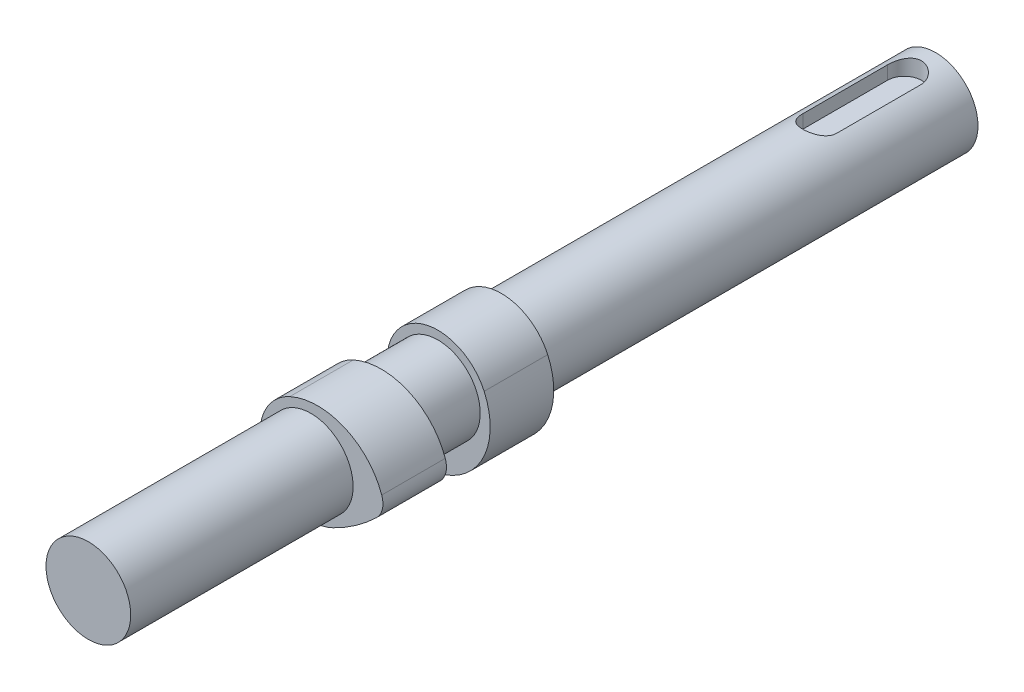
ISO-10303-21;
HEADER;
FILE_DESCRIPTION(('STEP AP214'),'2;1');
FILE_NAME('part.step','',(''),(''),'','','');
FILE_SCHEMA(('AUTOMOTIVE_DESIGN { 1 0 10303 214 1 1 1 1 }'));
ENDSEC;
DATA;
#1=APPLICATION_CONTEXT('core data for automotive mechanical design processes');
#2=APPLICATION_PROTOCOL_DEFINITION('international standard','automotive_design',2000,#1);
#3=PRODUCT_CONTEXT('',#1,'mechanical');
#4=PRODUCT('Part','Part','',(#3));
#5=PRODUCT_RELATED_PRODUCT_CATEGORY('part','',(#4));
#6=PRODUCT_DEFINITION_FORMATION('','',#4);
#7=PRODUCT_DEFINITION_CONTEXT('part definition',#1,'design');
#8=PRODUCT_DEFINITION('design','',#6,#7);
#9=PRODUCT_DEFINITION_SHAPE('','',#8);
#10=(LENGTH_UNIT() NAMED_UNIT(*) SI_UNIT(.MILLI.,.METRE.));
#11=(NAMED_UNIT(*) PLANE_ANGLE_UNIT() SI_UNIT($,.RADIAN.));
#12=(NAMED_UNIT(*) SI_UNIT($,.STERADIAN.) SOLID_ANGLE_UNIT());
#13=UNCERTAINTY_MEASURE_WITH_UNIT(LENGTH_MEASURE(1.E-05),#10,'distance_accuracy_value','');
#14=(GEOMETRIC_REPRESENTATION_CONTEXT(3) GLOBAL_UNCERTAINTY_ASSIGNED_CONTEXT((#13)) GLOBAL_UNIT_ASSIGNED_CONTEXT((#10,
#11,#12)) REPRESENTATION_CONTEXT('',''));
#15=CARTESIAN_POINT('',(0.,0.,0.));
#16=DIRECTION('',(0.,0.,1.));
#17=DIRECTION('',(1.,0.,0.));
#18=AXIS2_PLACEMENT_3D('',#15,#16,#17);
#19=CARTESIAN_POINT('',(0.,0.,200.));
#20=DIRECTION('',(0.,0.,-1.));
#21=DIRECTION('',(-1.,0.,0.));
#22=AXIS2_PLACEMENT_3D('',#19,#20,#21);
#23=CYLINDRICAL_SURFACE('',#22,10.);
#24=CARTESIAN_POINT('',(0.,0.,132.5));
#25=DIRECTION('',(0.,0.,-1.));
#26=DIRECTION('',(-1.,0.,0.));
#27=AXIS2_PLACEMENT_3D('',#24,#25,#26);
#28=CIRCLE('',#27,10.);
#29=CARTESIAN_POINT('',(-10.,0.,132.5));
#30=VERTEX_POINT('',#29);
#31=EDGE_CURVE('E210',#30,#30,#28,.T.);
#32=ORIENTED_EDGE('',*,*,#31,.T.);
#33=EDGE_LOOP('',(#32));
#34=FACE_BOUND('',#33,.T.);
#35=CARTESIAN_POINT('',(0.,0.,117.5));
#36=DIRECTION('',(0.,0.,-1.));
#37=DIRECTION('',(-1.,0.,0.));
#38=AXIS2_PLACEMENT_3D('',#35,#36,#37);
#39=CIRCLE('',#38,10.);
#40=CARTESIAN_POINT('',(-10.,0.,117.5));
#41=VERTEX_POINT('',#40);
#42=EDGE_CURVE('E11',#41,#41,#39,.T.);
#43=ORIENTED_EDGE('',*,*,#42,.F.);
#44=EDGE_LOOP('',(#43));
#45=FACE_BOUND('',#44,.T.);
#46=ADVANCED_FACE('F39',(#34,#45),#23,.T.);
#47=CARTESIAN_POINT('',(1.6509102244389,-3.64341809717785,147.5));
#48=DIRECTION('',(0.,0.,-1.));
#49=DIRECTION('',(-1.,0.,0.));
#50=AXIS2_PLACEMENT_3D('',#47,#48,#49);
#51=CYLINDRICAL_SURFACE('',#50,16.);
#52=CARTESIAN_POINT('',(1.6509102244389,-3.64341809717785,132.5));
#53=DIRECTION('',(0.,0.,1.));
#54=DIRECTION('',(-1.,0.,0.));
#55=AXIS2_PLACEMENT_3D('',#52,#53,#54);
#56=CIRCLE('',#55,16.);
#57=CARTESIAN_POINT('',(16.7477680798005,1.65609913508084,132.5));
#58=VERTEX_POINT('',#57);
#59=CARTESIAN_POINT('',(-4.9527306733167,10.9302542915336,132.5));
#60=VERTEX_POINT('',#59);
#61=EDGE_CURVE('E164',#58,#60,#56,.T.);
#62=ORIENTED_EDGE('',*,*,#61,.T.);
#63=DIRECTION('',(0.,0.,-1.));
#64=VECTOR('',#63,1.);
#65=CARTESIAN_POINT('',(-4.9527306733167,10.9302542915336,147.5));
#66=LINE('',#65,#64);
#67=CARTESIAN_POINT('',(-4.9527306733167,10.9302542915336,147.5));
#68=VERTEX_POINT('',#67);
#69=EDGE_CURVE('E206',#68,#60,#66,.T.);
#70=ORIENTED_EDGE('',*,*,#69,.F.);
#71=CARTESIAN_POINT('',(1.6509102244389,-3.64341809717785,147.5));
#72=DIRECTION('',(0.,0.,1.));
#73=DIRECTION('',(-1.,0.,0.));
#74=AXIS2_PLACEMENT_3D('',#71,#72,#73);
#75=CIRCLE('',#74,16.);
#76=CARTESIAN_POINT('',(16.7477680798005,1.65609913508084,147.5));
#77=VERTEX_POINT('',#76);
#78=EDGE_CURVE('E169',#77,#68,#75,.T.);
#79=ORIENTED_EDGE('',*,*,#78,.F.);
#80=DIRECTION('',(0.,0.,-1.));
#81=VECTOR('',#80,1.);
#82=CARTESIAN_POINT('',(16.7477680798005,1.65609913508084,147.5));
#83=LINE('',#82,#81);
#84=EDGE_CURVE('E183',#77,#58,#83,.T.);
#85=ORIENTED_EDGE('',*,*,#84,.T.);
#86=EDGE_LOOP('',(#62,#70,#79,#85));
#87=FACE_BOUND('',#86,.T.);
#88=ADVANCED_FACE('F289',(#87),#51,.T.);
#89=CARTESIAN_POINT('',(0.,0.,147.5));
#90=DIRECTION('',(0.,0.,-1.));
#91=DIRECTION('',(-1.,0.,0.));
#92=AXIS2_PLACEMENT_3D('',#89,#90,#91);
#93=CYLINDRICAL_SURFACE('',#92,12.);
#94=CARTESIAN_POINT('',(0.,0.,132.5));
#95=DIRECTION('',(0.,0.,1.));
#96=DIRECTION('',(1.,0.,0.));
#97=AXIS2_PLACEMENT_3D('',#94,#95,#96);
#98=CIRCLE('',#97,12.);
#99=CARTESIAN_POINT('',(5.27750445315283,-10.777195681018,132.5));
#100=VERTEX_POINT('',#99);
#101=EDGE_CURVE('E187',#60,#100,#98,.T.);
#102=ORIENTED_EDGE('',*,*,#101,.T.);
#103=DIRECTION('',(0.,0.,-1.));
#104=VECTOR('',#103,1.);
#105=CARTESIAN_POINT('',(5.27750445315283,-10.777195681018,147.5));
#106=LINE('',#105,#104);
#107=CARTESIAN_POINT('',(5.27750445315283,-10.777195681018,147.5));
#108=VERTEX_POINT('',#107);
#109=EDGE_CURVE('E202',#108,#100,#106,.T.);
#110=ORIENTED_EDGE('',*,*,#109,.F.);
#111=CARTESIAN_POINT('',(0.,0.,147.5));
#112=DIRECTION('',(0.,0.,1.));
#113=DIRECTION('',(1.,0.,0.));
#114=AXIS2_PLACEMENT_3D('',#111,#112,#113);
#115=CIRCLE('',#114,12.);
#116=EDGE_CURVE('E173',#68,#108,#115,.T.);
#117=ORIENTED_EDGE('',*,*,#116,.F.);
#118=ORIENTED_EDGE('',*,*,#69,.T.);
#119=EDGE_LOOP('',(#102,#110,#117,#118));
#120=FACE_BOUND('',#119,.T.);
#121=ADVANCED_FACE('F294',(#120),#93,.T.);
#122=CARTESIAN_POINT('',(-12.3141770573566,25.1467899223752,147.5));
#123=DIRECTION('',(0.,0.,-1.));
#124=DIRECTION('',(-1.,0.,0.));
#125=AXIS2_PLACEMENT_3D('',#122,#123,#124);
#126=CYLINDRICAL_SURFACE('',#125,40.);
#127=CARTESIAN_POINT('',(-12.3141770573566,25.1467899223752,132.5));
#128=DIRECTION('',(0.,0.,1.));
#129=DIRECTION('',(-1.,0.,0.));
#130=AXIS2_PLACEMENT_3D('',#127,#128,#129);
#131=CIRCLE('',#130,40.);
#132=CARTESIAN_POINT('',(15.5077395796224,-3.5923985603393,132.5));
#133=VERTEX_POINT('',#132);
#134=EDGE_CURVE('E190',#100,#133,#131,.T.);
#135=ORIENTED_EDGE('',*,*,#134,.T.);
#136=DIRECTION('',(0.,0.,-1.));
#137=VECTOR('',#136,1.);
#138=CARTESIAN_POINT('',(15.5077395796224,-3.5923985603393,147.5));
#139=LINE('',#138,#137);
#140=CARTESIAN_POINT('',(15.5077395796224,-3.5923985603393,147.5));
#141=VERTEX_POINT('',#140);
#142=EDGE_CURVE('E198',#141,#133,#139,.T.);
#143=ORIENTED_EDGE('',*,*,#142,.F.);
#144=CARTESIAN_POINT('',(-12.3141770573566,25.1467899223752,147.5));
#145=DIRECTION('',(0.,0.,1.));
#146=DIRECTION('',(-1.,0.,0.));
#147=AXIS2_PLACEMENT_3D('',#144,#145,#146);
#148=CIRCLE('',#147,40.);
#149=EDGE_CURVE('E177',#108,#141,#148,.T.);
#150=ORIENTED_EDGE('',*,*,#149,.F.);
#151=ORIENTED_EDGE('',*,*,#109,.T.);
#152=EDGE_LOOP('',(#135,#143,#150,#151));
#153=FACE_BOUND('',#152,.T.);
#154=ADVANCED_FACE('F341',(#153),#126,.T.);
#155=CARTESIAN_POINT('',(12.03,0.,147.5));
#156=DIRECTION('',(0.,0.,-1.));
#157=DIRECTION('',(-1.,0.,0.));
#158=AXIS2_PLACEMENT_3D('',#155,#156,#157);
#159=CYLINDRICAL_SURFACE('',#158,5.);
#160=CARTESIAN_POINT('',(12.03,0.,132.5));
#161=DIRECTION('',(0.,0.,1.));
#162=DIRECTION('',(-1.,0.,0.));
#163=AXIS2_PLACEMENT_3D('',#160,#161,#162);
#164=CIRCLE('',#163,5.);
#165=EDGE_CURVE('E174',#133,#58,#164,.T.);
#166=ORIENTED_EDGE('',*,*,#165,.T.);
#167=ORIENTED_EDGE('',*,*,#84,.F.);
#168=CARTESIAN_POINT('',(12.03,0.,147.5));
#169=DIRECTION('',(0.,0.,1.));
#170=DIRECTION('',(-1.,0.,0.));
#171=AXIS2_PLACEMENT_3D('',#168,#169,#170);
#172=CIRCLE('',#171,5.);
#173=EDGE_CURVE('E180',#141,#77,#172,.T.);
#174=ORIENTED_EDGE('',*,*,#173,.F.);
#175=ORIENTED_EDGE('',*,*,#142,.T.);
#176=EDGE_LOOP('',(#166,#167,#174,#175));
#177=FACE_BOUND('',#176,.T.);
#178=ADVANCED_FACE('F345',(#177),#159,.T.);
#179=CARTESIAN_POINT('',(6.84045511221945,-1.82170904858893,147.5));
#180=DIRECTION('',(0.,0.,-1.));
#181=DIRECTION('',(-1.,0.,0.));
#182=AXIS2_PLACEMENT_3D('',#179,#180,#181);
#183=PLANE('',#182);
#184=CARTESIAN_POINT('',(0.,0.,147.5));
#185=DIRECTION('',(0.,0.,-1.));
#186=DIRECTION('',(-1.,0.,0.));
#187=AXIS2_PLACEMENT_3D('',#184,#185,#186);
#188=CIRCLE('',#187,10.);
#189=CARTESIAN_POINT('',(-10.,0.,147.5));
#190=VERTEX_POINT('',#189);
#191=EDGE_CURVE('E49',#190,#190,#188,.T.);
#192=ORIENTED_EDGE('',*,*,#191,.T.);
#193=EDGE_LOOP('',(#192));
#194=FACE_BOUND('',#193,.T.);
#195=ORIENTED_EDGE('',*,*,#78,.T.);
#196=ORIENTED_EDGE('',*,*,#116,.T.);
#197=ORIENTED_EDGE('',*,*,#149,.T.);
#198=ORIENTED_EDGE('',*,*,#173,.T.);
#199=EDGE_LOOP('',(#195,#196,#197,#198));
#200=FACE_BOUND('',#199,.T.);
#201=ADVANCED_FACE('F349',(#194,#200),#183,.F.);
#202=CARTESIAN_POINT('',(6.84045511221945,-1.82170904858893,132.5));
#203=DIRECTION('',(0.,0.,-1.));
#204=DIRECTION('',(-1.,0.,0.));
#205=AXIS2_PLACEMENT_3D('',#202,#203,#204);
#206=PLANE('',#205);
#207=ORIENTED_EDGE('',*,*,#31,.F.);
#208=EDGE_LOOP('',(#207));
#209=FACE_BOUND('',#208,.T.);
#210=ORIENTED_EDGE('',*,*,#61,.F.);
#211=ORIENTED_EDGE('',*,*,#165,.F.);
#212=ORIENTED_EDGE('',*,*,#134,.F.);
#213=ORIENTED_EDGE('',*,*,#101,.F.);
#214=EDGE_LOOP('',(#210,#211,#212,#213));
#215=FACE_BOUND('',#214,.T.);
#216=ADVANCED_FACE('F279',(#209,#215),#206,.T.);
#217=CARTESIAN_POINT('',(0.,0.,200.));
#218=DIRECTION('',(0.,0.,1.));
#219=DIRECTION('',(1.,0.,0.));
#220=AXIS2_PLACEMENT_3D('',#217,#218,#219);
#221=PLANE('',#220);
#222=CARTESIAN_POINT('',(0.,0.,200.));
#223=DIRECTION('',(0.,0.,1.));
#224=DIRECTION('',(1.,0.,0.));
#225=AXIS2_PLACEMENT_3D('',#222,#223,#224);
#226=CIRCLE('',#225,10.);
#227=CARTESIAN_POINT('',(10.,0.,200.));
#228=VERTEX_POINT('',#227);
#229=EDGE_CURVE('E239',#228,#228,#226,.T.);
#230=ORIENTED_EDGE('',*,*,#229,.T.);
#231=EDGE_LOOP('',(#230));
#232=FACE_BOUND('',#231,.T.);
#233=ADVANCED_FACE('F276',(#232),#221,.T.);
#234=ORIENTED_EDGE('',*,*,#229,.F.);
#235=EDGE_LOOP('',(#234));
#236=FACE_BOUND('',#235,.T.);
#237=ORIENTED_EDGE('',*,*,#191,.F.);
#238=EDGE_LOOP('',(#237));
#239=FACE_BOUND('',#238,.T.);
#240=ADVANCED_FACE('F278',(#236,#239),#23,.T.);
#241=CARTESIAN_POINT('',(-3.64341809717782,-1.65091022443892,117.5));
#242=DIRECTION('',(0.,0.,-1.));
#243=DIRECTION('',(-1.,0.,0.));
#244=AXIS2_PLACEMENT_3D('',#241,#242,#243);
#245=CYLINDRICAL_SURFACE('',#244,16.);
#246=CARTESIAN_POINT('',(-3.64341809717782,-1.65091022443892,102.5));
#247=DIRECTION('',(0.,0.,1.));
#248=DIRECTION('',(-1.,0.,0.));
#249=AXIS2_PLACEMENT_3D('',#246,#247,#248);
#250=CIRCLE('',#249,16.);
#251=CARTESIAN_POINT('',(1.65609913508084,-16.7477680798005,102.5));
#252=VERTEX_POINT('',#251);
#253=CARTESIAN_POINT('',(10.9302542915335,4.9527306733168,102.5));
#254=VERTEX_POINT('',#253);
#255=EDGE_CURVE('E157',#252,#254,#250,.T.);
#256=ORIENTED_EDGE('',*,*,#255,.T.);
#257=DIRECTION('',(0.,0.,-1.));
#258=VECTOR('',#257,1.);
#259=CARTESIAN_POINT('',(10.9302542915335,4.9527306733168,117.5));
#260=LINE('',#259,#258);
#261=CARTESIAN_POINT('',(10.9302542915335,4.9527306733168,117.5));
#262=VERTEX_POINT('',#261);
#263=EDGE_CURVE('E135',#262,#254,#260,.T.);
#264=ORIENTED_EDGE('',*,*,#263,.F.);
#265=CARTESIAN_POINT('',(-3.64341809717782,-1.65091022443892,117.5));
#266=DIRECTION('',(0.,0.,1.));
#267=DIRECTION('',(-1.,0.,0.));
#268=AXIS2_PLACEMENT_3D('',#265,#266,#267);
#269=CIRCLE('',#268,16.);
#270=CARTESIAN_POINT('',(1.65609913508084,-16.7477680798005,117.5));
#271=VERTEX_POINT('',#270);
#272=EDGE_CURVE('E143',#271,#262,#269,.T.);
#273=ORIENTED_EDGE('',*,*,#272,.F.);
#274=DIRECTION('',(0.,0.,-1.));
#275=VECTOR('',#274,1.);
#276=CARTESIAN_POINT('',(1.65609913508084,-16.7477680798005,117.5));
#277=LINE('',#276,#275);
#278=EDGE_CURVE('E495',#271,#252,#277,.T.);
#279=ORIENTED_EDGE('',*,*,#278,.T.);
#280=EDGE_LOOP('',(#256,#264,#273,#279));
#281=FACE_BOUND('',#280,.T.);
#282=ADVANCED_FACE('F155',(#281),#245,.T.);
#283=CARTESIAN_POINT('',(0.,0.,117.5));
#284=DIRECTION('',(0.,0.,-1.));
#285=DIRECTION('',(-1.,0.,0.));
#286=AXIS2_PLACEMENT_3D('',#283,#284,#285);
#287=CYLINDRICAL_SURFACE('',#286,12.);
#288=CARTESIAN_POINT('',(0.,0.,102.5));
#289=DIRECTION('',(0.,0.,1.));
#290=DIRECTION('',(1.,0.,0.));
#291=AXIS2_PLACEMENT_3D('',#288,#289,#290);
#292=CIRCLE('',#291,12.);
#293=CARTESIAN_POINT('',(-10.777195681018,-5.27750445315283,102.5));
#294=VERTEX_POINT('',#293);
#295=EDGE_CURVE('E504',#254,#294,#292,.T.);
#296=ORIENTED_EDGE('',*,*,#295,.T.);
#297=DIRECTION('',(0.,0.,-1.));
#298=VECTOR('',#297,1.);
#299=CARTESIAN_POINT('',(-10.777195681018,-5.27750445315283,117.5));
#300=LINE('',#299,#298);
#301=CARTESIAN_POINT('',(-10.777195681018,-5.27750445315283,117.5));
#302=VERTEX_POINT('',#301);
#303=EDGE_CURVE('E138',#302,#294,#300,.T.);
#304=ORIENTED_EDGE('',*,*,#303,.F.);
#305=CARTESIAN_POINT('',(0.,0.,117.5));
#306=DIRECTION('',(0.,0.,1.));
#307=DIRECTION('',(1.,0.,0.));
#308=AXIS2_PLACEMENT_3D('',#305,#306,#307);
#309=CIRCLE('',#308,12.);
#310=EDGE_CURVE('E131',#262,#302,#309,.T.);
#311=ORIENTED_EDGE('',*,*,#310,.F.);
#312=ORIENTED_EDGE('',*,*,#263,.T.);
#313=EDGE_LOOP('',(#296,#304,#311,#312));
#314=FACE_BOUND('',#313,.T.);
#315=ADVANCED_FACE('F133',(#314),#287,.T.);
#316=CARTESIAN_POINT('',(25.1467899223752,12.3141770573566,117.5));
#317=DIRECTION('',(0.,0.,-1.));
#318=DIRECTION('',(-1.,0.,0.));
#319=AXIS2_PLACEMENT_3D('',#316,#317,#318);
#320=CYLINDRICAL_SURFACE('',#319,40.);
#321=CARTESIAN_POINT('',(25.1467899223752,12.3141770573566,102.5));
#322=DIRECTION('',(0.,0.,1.));
#323=DIRECTION('',(-1.,0.,0.));
#324=AXIS2_PLACEMENT_3D('',#321,#322,#323);
#325=CIRCLE('',#324,40.);
#326=CARTESIAN_POINT('',(-3.59239856033932,-15.5077395796224,102.5));
#327=VERTEX_POINT('',#326);
#328=EDGE_CURVE('E500',#294,#327,#325,.T.);
#329=ORIENTED_EDGE('',*,*,#328,.T.);
#330=DIRECTION('',(0.,0.,-1.));
#331=VECTOR('',#330,1.);
#332=CARTESIAN_POINT('',(-3.59239856033932,-15.5077395796224,117.5));
#333=LINE('',#332,#331);
#334=CARTESIAN_POINT('',(-3.59239856033932,-15.5077395796224,117.5));
#335=VERTEX_POINT('',#334);
#336=EDGE_CURVE('E165',#335,#327,#333,.T.);
#337=ORIENTED_EDGE('',*,*,#336,.F.);
#338=CARTESIAN_POINT('',(25.1467899223752,12.3141770573566,117.5));
#339=DIRECTION('',(0.,0.,1.));
#340=DIRECTION('',(-1.,0.,0.));
#341=AXIS2_PLACEMENT_3D('',#338,#339,#340);
#342=CIRCLE('',#341,40.);
#343=EDGE_CURVE('E142',#302,#335,#342,.T.);
#344=ORIENTED_EDGE('',*,*,#343,.F.);
#345=ORIENTED_EDGE('',*,*,#303,.T.);
#346=EDGE_LOOP('',(#329,#337,#344,#345));
#347=FACE_BOUND('',#346,.T.);
#348=ADVANCED_FACE('F358',(#347),#320,.T.);
#349=CARTESIAN_POINT('',(0.,-12.03,117.5));
#350=DIRECTION('',(0.,0.,-1.));
#351=DIRECTION('',(-1.,0.,0.));
#352=AXIS2_PLACEMENT_3D('',#349,#350,#351);
#353=CYLINDRICAL_SURFACE('',#352,5.00000000000001);
#354=CARTESIAN_POINT('',(0.,-12.03,102.5));
#355=DIRECTION('',(0.,0.,1.));
#356=DIRECTION('',(-1.,0.,0.));
#357=AXIS2_PLACEMENT_3D('',#354,#355,#356);
#358=CIRCLE('',#357,5.00000000000001);
#359=EDGE_CURVE('E153',#327,#252,#358,.T.);
#360=ORIENTED_EDGE('',*,*,#359,.T.);
#361=ORIENTED_EDGE('',*,*,#278,.F.);
#362=CARTESIAN_POINT('',(0.,-12.03,117.5));
#363=DIRECTION('',(0.,0.,1.));
#364=DIRECTION('',(-1.,0.,0.));
#365=AXIS2_PLACEMENT_3D('',#362,#363,#364);
#366=CIRCLE('',#365,5.00000000000001);
#367=EDGE_CURVE('E148',#335,#271,#366,.T.);
#368=ORIENTED_EDGE('',*,*,#367,.F.);
#369=ORIENTED_EDGE('',*,*,#336,.T.);
#370=EDGE_LOOP('',(#360,#361,#368,#369));
#371=FACE_BOUND('',#370,.T.);
#372=ADVANCED_FACE('F361',(#371),#353,.T.);
#373=CARTESIAN_POINT('',(-1.82170904858891,-6.84045511221947,117.5));
#374=DIRECTION('',(0.,0.,-1.));
#375=DIRECTION('',(-1.,0.,0.));
#376=AXIS2_PLACEMENT_3D('',#373,#374,#375);
#377=PLANE('',#376);
#378=ORIENTED_EDGE('',*,*,#42,.T.);
#379=EDGE_LOOP('',(#378));
#380=FACE_BOUND('',#379,.T.);
#381=ORIENTED_EDGE('',*,*,#272,.T.);
#382=ORIENTED_EDGE('',*,*,#310,.T.);
#383=ORIENTED_EDGE('',*,*,#343,.T.);
#384=ORIENTED_EDGE('',*,*,#367,.T.);
#385=EDGE_LOOP('',(#381,#382,#383,#384));
#386=FACE_BOUND('',#385,.T.);
#387=ADVANCED_FACE('F146',(#380,#386),#377,.F.);
#388=CARTESIAN_POINT('',(-1.82170904858891,-6.84045511221947,102.5));
#389=DIRECTION('',(0.,0.,-1.));
#390=DIRECTION('',(-1.,0.,0.));
#391=AXIS2_PLACEMENT_3D('',#388,#389,#390);
#392=PLANE('',#391);
#393=CARTESIAN_POINT('',(0.,0.,102.5));
#394=DIRECTION('',(0.,0.,-1.));
#395=DIRECTION('',(-1.,0.,0.));
#396=AXIS2_PLACEMENT_3D('',#393,#394,#395);
#397=CIRCLE('',#396,10.);
#398=CARTESIAN_POINT('',(-10.,0.,102.5));
#399=VERTEX_POINT('',#398);
#400=EDGE_CURVE('E159',#399,#399,#397,.T.);
#401=ORIENTED_EDGE('',*,*,#400,.F.);
#402=EDGE_LOOP('',(#401));
#403=FACE_BOUND('',#402,.T.);
#404=ORIENTED_EDGE('',*,*,#255,.F.);
#405=ORIENTED_EDGE('',*,*,#359,.F.);
#406=ORIENTED_EDGE('',*,*,#328,.F.);
#407=ORIENTED_EDGE('',*,*,#295,.F.);
#408=EDGE_LOOP('',(#404,#405,#406,#407));
#409=FACE_BOUND('',#408,.T.);
#410=ADVANCED_FACE('F331',(#403,#409),#392,.T.);
#411=CARTESIAN_POINT('',(0.,6.,7.3660851374526));
#412=DIRECTION('',(0.,1.,0.));
#413=DIRECTION('',(0.,0.,1.));
#414=AXIS2_PLACEMENT_3D('',#411,#412,#413);
#415=PLANE('',#414);
#416=CARTESIAN_POINT('',(0.,6.,7.3660851374526));
#417=DIRECTION('',(0.,1.,0.));
#418=DIRECTION('',(0.,0.,1.));
#419=AXIS2_PLACEMENT_3D('',#416,#417,#418);
#420=CIRCLE('',#419,4.);
#421=CARTESIAN_POINT('',(4.,6.,7.3660851374526));
#422=VERTEX_POINT('',#421);
#423=CARTESIAN_POINT('',(-4.,6.,7.3660851374526));
#424=VERTEX_POINT('',#423);
#425=EDGE_CURVE('E211',#422,#424,#420,.T.);
#426=ORIENTED_EDGE('',*,*,#425,.T.);
#427=DIRECTION('',(0.,0.,1.));
#428=VECTOR('',#427,1.);
#429=CARTESIAN_POINT('',(-4.,6.,7.3660851374526));
#430=LINE('',#429,#428);
#431=CARTESIAN_POINT('',(-4.,6.,27.3660851374526));
#432=VERTEX_POINT('',#431);
#433=EDGE_CURVE('E215',#424,#432,#430,.T.);
#434=ORIENTED_EDGE('',*,*,#433,.T.);
#435=CARTESIAN_POINT('',(0.,6.,27.3660851374526));
#436=DIRECTION('',(0.,1.,0.));
#437=DIRECTION('',(0.,0.,1.));
#438=AXIS2_PLACEMENT_3D('',#435,#436,#437);
#439=CIRCLE('',#438,4.);
#440=CARTESIAN_POINT('',(4.,6.,27.3660851374526));
#441=VERTEX_POINT('',#440);
#442=EDGE_CURVE('E219',#432,#441,#439,.T.);
#443=ORIENTED_EDGE('',*,*,#442,.T.);
#444=DIRECTION('',(0.,0.,-1.));
#445=VECTOR('',#444,1.);
#446=CARTESIAN_POINT('',(4.,6.,7.3660851374526));
#447=LINE('',#446,#445);
#448=EDGE_CURVE('E223',#441,#422,#447,.T.);
#449=ORIENTED_EDGE('',*,*,#448,.T.);
#450=EDGE_LOOP('',(#426,#434,#443,#449));
#451=FACE_BOUND('',#450,.T.);
#452=ADVANCED_FACE('F326',(#451),#415,.T.);
#453=CARTESIAN_POINT('',(4.,10.,7.3660851374526));
#454=DIRECTION('',(-1.,0.,0.));
#455=DIRECTION('',(0.,0.,1.));
#456=AXIS2_PLACEMENT_3D('',#453,#454,#455);
#457=PLANE('',#456);
#458=DIRECTION('',(0.,0.,-1.));
#459=VECTOR('',#458,1.);
#460=CARTESIAN_POINT('',(4.,9.16515138991168,200.));
#461=LINE('',#460,#459);
#462=CARTESIAN_POINT('',(4.,9.16515138991168,27.3660851374526));
#463=VERTEX_POINT('',#462);
#464=CARTESIAN_POINT('',(4.,9.16515138991168,7.3660851374526));
#465=VERTEX_POINT('',#464);
#466=EDGE_CURVE('E315',#463,#465,#461,.T.);
#467=ORIENTED_EDGE('',*,*,#466,.T.);
#468=DIRECTION('',(0.,-1.,0.));
#469=VECTOR('',#468,1.);
#470=CARTESIAN_POINT('',(4.,10.,7.3660851374526));
#471=LINE('',#470,#469);
#472=EDGE_CURVE('E227',#465,#422,#471,.T.);
#473=ORIENTED_EDGE('',*,*,#472,.T.);
#474=ORIENTED_EDGE('',*,*,#448,.F.);
#475=DIRECTION('',(0.,-1.,0.));
#476=VECTOR('',#475,1.);
#477=CARTESIAN_POINT('',(4.,10.,27.3660851374526));
#478=LINE('',#477,#476);
#479=EDGE_CURVE('E56',#463,#441,#478,.T.);
#480=ORIENTED_EDGE('',*,*,#479,.F.);
#481=EDGE_LOOP('',(#467,#473,#474,#480));
#482=FACE_BOUND('',#481,.T.);
#483=ADVANCED_FACE('F268',(#482),#457,.T.);
#484=CARTESIAN_POINT('',(0.,10.,7.3660851374526));
#485=DIRECTION('',(0.,-1.,0.));
#486=DIRECTION('',(0.,0.,-1.));
#487=AXIS2_PLACEMENT_3D('',#484,#485,#486);
#488=CYLINDRICAL_SURFACE('',#487,4.);
#489=ORIENTED_EDGE('',*,*,#472,.F.);
#490=CARTESIAN_POINT('',(4.,9.16515138991168,7.3660851374526));
#491=CARTESIAN_POINT('',(4.00001596071937,9.16512928809545,7.25847343239845));
#492=CARTESIAN_POINT('',(3.99565782731265,9.16704612011429,7.1508738062859));
#493=CARTESIAN_POINT('',(3.9783181194646,9.17459250745478,6.93654254091386));
#494=CARTESIAN_POINT('',(3.96533982937531,9.18022064873058,6.8298105867357));
#495=CARTESIAN_POINT('',(3.93095207352899,9.19499565865171,6.61839149434633));
#496=CARTESIAN_POINT('',(3.90957593640916,9.20412861441611,6.51369796936755));
#497=CARTESIAN_POINT('',(3.85863260381273,9.22560106586819,6.30668359402068));
#498=CARTESIAN_POINT('',(3.82906490834147,9.23794075728509,6.20436288889754));
#499=CARTESIAN_POINT('',(3.72853943587111,9.2791858250141,5.90221343629012));
#500=CARTESIAN_POINT('',(3.64568978920221,9.3123489831615,5.70677667606978));
#501=CARTESIAN_POINT('',(3.45096383184146,9.3862474152947,5.33249397729066));
#502=CARTESIAN_POINT('',(3.33905992673093,9.42698987727426,5.15366403154403));
#503=CARTESIAN_POINT('',(3.08263671474505,9.51401998804847,4.80756034408865));
#504=CARTESIAN_POINT('',(2.93673827988499,9.56048491272144,4.64135070355221));
#505=CARTESIAN_POINT('',(2.61939292349377,9.652255810962,4.33500459309109));
#506=CARTESIAN_POINT('',(2.44794076987997,9.69756154495612,4.19487347594541));
#507=CARTESIAN_POINT('',(2.07601181629752,9.78406834216145,3.93927234882814));
#508=CARTESIAN_POINT('',(1.87465586655101,9.82503649102096,3.82499551804244));
#509=CARTESIAN_POINT('',(1.45364828604451,9.89607888234979,3.63239699296125));
#510=CARTESIAN_POINT('',(1.2340043363753,9.92615767032247,3.55406029265928));
#511=CARTESIAN_POINT('',(0.793934884187364,9.97076629361036,3.43940273168169));
#512=CARTESIAN_POINT('',(0.574062114869016,9.98597845290694,3.40123122414947));
#513=CARTESIAN_POINT('',(0.130536855092198,10.001606202074,3.36202818904912));
#514=CARTESIAN_POINT('',(-0.0931142682526846,10.0020270338048,3.36098350420085));
#515=CARTESIAN_POINT('',(-0.524466731987237,9.98843920775428,3.39505077538085));
#516=CARTESIAN_POINT('',(-0.732358330632758,9.97523973659777,3.42813508400578));
#517=CARTESIAN_POINT('',(-1.13934964738689,9.93698538393897,3.52607213836282));
#518=CARTESIAN_POINT('',(-1.33844886722559,9.91192983148495,3.59092668202297));
#519=CARTESIAN_POINT('',(-1.72579479688349,9.85193670608706,3.75135717522455));
#520=CARTESIAN_POINT('',(-1.91383264586892,9.81685584875391,3.84738153329166));
#521=CARTESIAN_POINT('',(-2.27161599563071,9.74029168639969,4.0670164011574));
#522=CARTESIAN_POINT('',(-2.4413550479227,9.69880613681324,4.19063658889047));
#523=CARTESIAN_POINT('',(-2.76952257830691,9.61043706268122,4.47136519488905));
#524=CARTESIAN_POINT('',(-2.92647922614483,9.56337795745419,4.63013815456902));
#525=CARTESIAN_POINT('',(-3.2122147086262,9.47123359153046,4.97207727411541));
#526=CARTESIAN_POINT('',(-3.34098070594789,9.42614923753061,5.15525448625222));
#527=CARTESIAN_POINT('',(-3.51186134851389,9.36326134539254,5.44772078307601));
#528=CARTESIAN_POINT('',(-3.56571263251516,9.34283170142194,5.54975697576753));
#529=CARTESIAN_POINT('',(-3.6645476150566,9.30450957703984,5.75847743986183));
#530=CARTESIAN_POINT('',(-3.70953513634086,9.28661600381593,5.86515968317991));
#531=CARTESIAN_POINT('',(-3.79016254319007,9.25400250539921,6.08231406794887));
#532=CARTESIAN_POINT('',(-3.82581403809399,9.2392786427695,6.19278130749397));
#533=CARTESIAN_POINT('',(-3.88744848158464,9.2135146773091,6.41675350560132));
#534=CARTESIAN_POINT('',(-3.91343576505912,9.20247292309662,6.53025707766516));
#535=CARTESIAN_POINT('',(-3.95619393609845,9.18417798205495,6.76353058479012));
#536=CARTESIAN_POINT('',(-3.97260125584169,9.17707470750587,6.88337933201645));
#537=CARTESIAN_POINT('',(-3.99451448409732,9.16754485606458,7.12417606658965));
#538=CARTESIAN_POINT('',(-4.0000271099601,9.16511539745838,7.24512333037531));
#539=CARTESIAN_POINT('',(-4.,9.16515138991168,7.3660851374526));
#540=B_SPLINE_CURVE_WITH_KNOTS('',3,(#490,#491,#492,#493,#494,#495,#496,#497,#498,#499,#500,
#501,#502,#503,#504,#505,#506,#507,#508,#509,#510,#511,#512,#513,#514,#515,#516,#517,#518,#519,
#520,#521,#522,#523,#524,#525,#526,#527,#528,#529,#530,#531,#532,#533,#534,#535,#536,#537,#538,
#539),.UNSPECIFIED.,.F.,.F.,(4,2,2,2,2,2,2,2,2,2,2,2,2,2,2,2,2,2,2,2,2,2,2,2,4),(0.,
0.322709706217836,0.645296527806424,0.96661582254377,1.28795473422462,1.9293660035182,
2.57138869889252,3.24636095994997,3.92147161082383,4.62325717855528,5.32474946398646,
5.9922775301254,6.65956903033311,7.28937830523071,7.91922322615309,8.55856353859093,
9.19812842270038,9.87963749353245,10.5614562641081,10.9125878460839,11.2635676597188,
11.614108935291,11.964492785171,12.3274303244848,12.6901440171997),.UNSPECIFIED.);
#541=CARTESIAN_POINT('',(-4.,9.16515138991168,7.3660851374526));
#542=VERTEX_POINT('',#541);
#543=EDGE_CURVE('E64',#465,#542,#540,.T.);
#544=ORIENTED_EDGE('',*,*,#543,.T.);
#545=DIRECTION('',(0.,-1.,0.));
#546=VECTOR('',#545,1.);
#547=CARTESIAN_POINT('',(-4.,10.,7.3660851374526));
#548=LINE('',#547,#546);
#549=EDGE_CURVE('E235',#542,#424,#548,.T.);
#550=ORIENTED_EDGE('',*,*,#549,.T.);
#551=ORIENTED_EDGE('',*,*,#425,.F.);
#552=EDGE_LOOP('',(#489,#544,#550,#551));
#553=FACE_BOUND('',#552,.T.);
#554=ADVANCED_FACE('F271',(#553),#488,.F.);
#555=CARTESIAN_POINT('',(-4.,10.,7.3660851374526));
#556=DIRECTION('',(1.,0.,0.));
#557=DIRECTION('',(0.,0.,-1.));
#558=AXIS2_PLACEMENT_3D('',#555,#556,#557);
#559=PLANE('',#558);
#560=DIRECTION('',(0.,0.,-1.));
#561=VECTOR('',#560,1.);
#562=CARTESIAN_POINT('',(-4.,9.16515138991168,200.));
#563=LINE('',#562,#561);
#564=CARTESIAN_POINT('',(-4.,9.16515138991168,27.3660851374526));
#565=VERTEX_POINT('',#564);
#566=EDGE_CURVE('E311',#542,#565,#563,.F.);
#567=ORIENTED_EDGE('',*,*,#566,.T.);
#568=DIRECTION('',(0.,-1.,0.));
#569=VECTOR('',#568,1.);
#570=CARTESIAN_POINT('',(-4.,10.,27.3660851374526));
#571=LINE('',#570,#569);
#572=EDGE_CURVE('E232',#565,#432,#571,.T.);
#573=ORIENTED_EDGE('',*,*,#572,.T.);
#574=ORIENTED_EDGE('',*,*,#433,.F.);
#575=ORIENTED_EDGE('',*,*,#549,.F.);
#576=EDGE_LOOP('',(#567,#573,#574,#575));
#577=FACE_BOUND('',#576,.T.);
#578=ADVANCED_FACE('F266',(#577),#559,.T.);
#579=CARTESIAN_POINT('',(0.,10.,27.3660851374526));
#580=DIRECTION('',(0.,-1.,0.));
#581=DIRECTION('',(0.,0.,-1.));
#582=AXIS2_PLACEMENT_3D('',#579,#580,#581);
#583=CYLINDRICAL_SURFACE('',#582,4.);
#584=ORIENTED_EDGE('',*,*,#572,.F.);
#585=CARTESIAN_POINT('',(-4.,9.16515138991168,27.3660851374526));
#586=CARTESIAN_POINT('',(-4.00001596071937,9.16512928809545,27.4736968425068));
#587=CARTESIAN_POINT('',(-3.99565782731265,9.16704612011429,27.5812964686193));
#588=CARTESIAN_POINT('',(-3.9783181194646,9.17459250745478,27.7956277339913));
#589=CARTESIAN_POINT('',(-3.96533982937531,9.18022064873058,27.9023596881695));
#590=CARTESIAN_POINT('',(-3.93095207352899,9.19499565865171,28.1137787805589));
#591=CARTESIAN_POINT('',(-3.90957593640916,9.20412861441611,28.2184723055377));
#592=CARTESIAN_POINT('',(-3.85863260381273,9.22560106586819,28.4254866808845));
#593=CARTESIAN_POINT('',(-3.82906490834147,9.23794075728509,28.5278073860077));
#594=CARTESIAN_POINT('',(-3.72853943587111,9.2791858250141,28.8299568386151));
#595=CARTESIAN_POINT('',(-3.64568978920221,9.3123489831615,29.0253935988354));
#596=CARTESIAN_POINT('',(-3.45096383184146,9.3862474152947,29.3996762976145));
#597=CARTESIAN_POINT('',(-3.33905992673093,9.42698987727426,29.5785062433612));
#598=CARTESIAN_POINT('',(-3.08263671474505,9.51401998804847,29.9246099308166));
#599=CARTESIAN_POINT('',(-2.936738279885,9.56048491272144,30.090819571353));
#600=CARTESIAN_POINT('',(-2.61939292349377,9.652255810962,30.3971656818141));
#601=CARTESIAN_POINT('',(-2.44794076987997,9.69756154495612,30.5372967989598));
#602=CARTESIAN_POINT('',(-2.07601181629752,9.78406834216145,30.7928979260771));
#603=CARTESIAN_POINT('',(-1.87465586655101,9.82503649102096,30.9071747568628));
#604=CARTESIAN_POINT('',(-1.45364828604451,9.89607888234979,31.099773281944));
#605=CARTESIAN_POINT('',(-1.2340043363753,9.92615767032247,31.1781099822459));
#606=CARTESIAN_POINT('',(-0.793934884187363,9.97076629361036,31.2927675432235));
#607=CARTESIAN_POINT('',(-0.574062114869014,9.98597845290694,31.3309390507557));
#608=CARTESIAN_POINT('',(-0.130536855092197,10.001606202074,31.3701420858561));
#609=CARTESIAN_POINT('',(0.0931142682526855,10.0020270338048,31.3711867707043));
#610=CARTESIAN_POINT('',(0.524466731987238,9.98843920775428,31.3371194995244));
#611=CARTESIAN_POINT('',(0.732358330632758,9.97523973659776,31.3040351908994));
#612=CARTESIAN_POINT('',(1.13934964738689,9.93698538393897,31.2060981365424));
#613=CARTESIAN_POINT('',(1.33844886722559,9.91192983148495,31.1412435928822));
#614=CARTESIAN_POINT('',(1.72579479688349,9.85193670608706,30.9808130996807));
#615=CARTESIAN_POINT('',(1.91383264586892,9.81685584875391,30.8847887416135));
#616=CARTESIAN_POINT('',(2.27161599563071,9.74029168639969,30.6651538737478));
#617=CARTESIAN_POINT('',(2.4413550479227,9.69880613681324,30.5415336860147));
#618=CARTESIAN_POINT('',(2.76952257830691,9.61043706268122,30.2608050800162));
#619=CARTESIAN_POINT('',(2.92647922614483,9.56337795745419,30.1020321203362));
#620=CARTESIAN_POINT('',(3.2122147086262,9.47123359153046,29.7600930007898));
#621=CARTESIAN_POINT('',(3.34098070594789,9.42614923753061,29.576915788653));
#622=CARTESIAN_POINT('',(3.51186134851389,9.36326134539254,29.2844494918292));
#623=CARTESIAN_POINT('',(3.56571263251516,9.34283170142194,29.1824132991377));
#624=CARTESIAN_POINT('',(3.6645476150566,9.30450957703985,28.9736928350434));
#625=CARTESIAN_POINT('',(3.70953513634086,9.28661600381593,28.8670105917253));
#626=CARTESIAN_POINT('',(3.79016254319008,9.25400250539921,28.6498562069563));
#627=CARTESIAN_POINT('',(3.82581403809399,9.2392786427695,28.5393889674112));
#628=CARTESIAN_POINT('',(3.88744848158464,9.2135146773091,28.3154167693039));
#629=CARTESIAN_POINT('',(3.91343576505912,9.20247292309662,28.20191319724));
#630=CARTESIAN_POINT('',(3.95619393609845,9.18417798205495,27.9686396901151));
#631=CARTESIAN_POINT('',(3.97260125584169,9.17707470750587,27.8487909428888));
#632=CARTESIAN_POINT('',(3.99451448409732,9.16754485606458,27.6079942083156));
#633=CARTESIAN_POINT('',(4.0000271099601,9.16511539745838,27.4870469445299));
#634=CARTESIAN_POINT('',(4.,9.16515138991168,27.3660851374526));
#635=B_SPLINE_CURVE_WITH_KNOTS('',3,(#585,#586,#587,#588,#589,#590,#591,#592,#593,#594,#595,
#596,#597,#598,#599,#600,#601,#602,#603,#604,#605,#606,#607,#608,#609,#610,#611,#612,#613,#614,
#615,#616,#617,#618,#619,#620,#621,#622,#623,#624,#625,#626,#627,#628,#629,#630,#631,#632,#633,
#634),.UNSPECIFIED.,.F.,.F.,(4,2,2,2,2,2,2,2,2,2,2,2,2,2,2,2,2,2,2,2,2,2,2,2,4),(0.,
0.322709706217834,0.645296527806424,0.966615822543771,1.28795473422462,1.9293660035182,
2.57138869889252,3.24636095994997,3.92147161082383,4.62325717855528,5.32474946398646,
5.9922775301254,6.65956903033312,7.2893783052307,7.91922322615309,8.55856353859093,
9.19812842270038,9.87963749353244,10.5614562641081,10.9125878460839,11.2635676597188,
11.614108935291,11.964492785171,12.3274303244848,12.6901440171997),.UNSPECIFIED.);
#636=EDGE_CURVE('E243',#565,#463,#635,.T.);
#637=ORIENTED_EDGE('',*,*,#636,.T.);
#638=ORIENTED_EDGE('',*,*,#479,.T.);
#639=ORIENTED_EDGE('',*,*,#442,.F.);
#640=EDGE_LOOP('',(#584,#637,#638,#639));
#641=FACE_BOUND('',#640,.T.);
#642=ADVANCED_FACE('F260',(#641),#583,.F.);
#643=CARTESIAN_POINT('',(0.,0.,0.));
#644=DIRECTION('',(0.,0.,1.));
#645=DIRECTION('',(1.,0.,0.));
#646=AXIS2_PLACEMENT_3D('',#643,#644,#645);
#647=PLANE('',#646);
#648=CARTESIAN_POINT('',(0.,0.,0.));
#649=DIRECTION('',(0.,0.,1.));
#650=DIRECTION('',(1.,0.,0.));
#651=AXIS2_PLACEMENT_3D('',#648,#649,#650);
#652=CIRCLE('',#651,10.);
#653=CARTESIAN_POINT('',(10.,0.,0.));
#654=VERTEX_POINT('',#653);
#655=EDGE_CURVE('E238',#654,#654,#652,.T.);
#656=ORIENTED_EDGE('',*,*,#655,.F.);
#657=EDGE_LOOP('',(#656));
#658=FACE_BOUND('',#657,.T.);
#659=ADVANCED_FACE('F265',(#658),#647,.F.);
#660=ORIENTED_EDGE('',*,*,#400,.T.);
#661=EDGE_LOOP('',(#660));
#662=FACE_BOUND('',#661,.T.);
#663=ORIENTED_EDGE('',*,*,#655,.T.);
#664=EDGE_LOOP('',(#663));
#665=FACE_BOUND('',#664,.T.);
#666=ORIENTED_EDGE('',*,*,#636,.F.);
#667=ORIENTED_EDGE('',*,*,#566,.F.);
#668=ORIENTED_EDGE('',*,*,#543,.F.);
#669=ORIENTED_EDGE('',*,*,#466,.F.);
#670=EDGE_LOOP('',(#666,#667,#668,#669));
#671=FACE_BOUND('',#670,.T.);
#672=ADVANCED_FACE('F41',(#662,#665,#671),#23,.T.);
#673=CLOSED_SHELL('',(#46,#88,#121,#154,#178,#201,#216,#233,#240,#282,#315,#348,#372,#387,#410,
#452,#483,#554,#578,#642,#659,#672));
#674=MANIFOLD_SOLID_BREP('B2',#673);
#675=ADVANCED_BREP_SHAPE_REPRESENTATION('',(#18,#674),#14);
#676=SHAPE_DEFINITION_REPRESENTATION(#9,#675);
ENDSEC;
END-ISO-10303-21;
